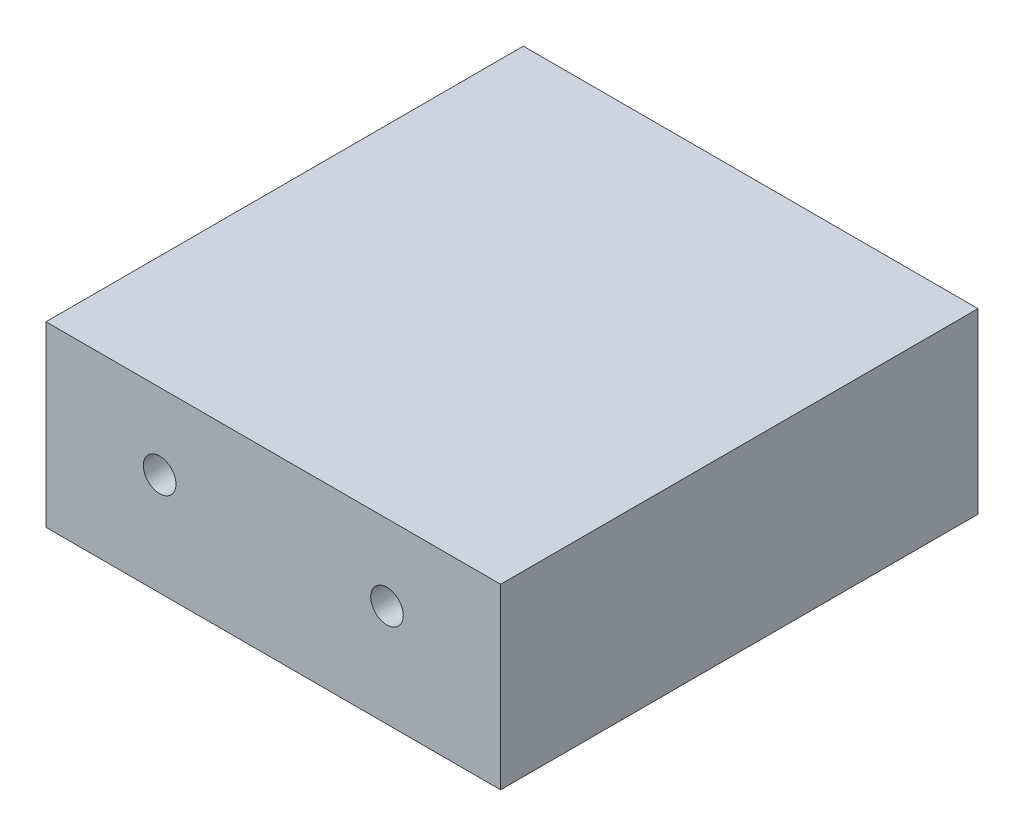
ISO-10303-21;
HEADER;
FILE_DESCRIPTION(('STEP AP214'),'2;1');
FILE_NAME('part.step','',(''),(''),'','','');
FILE_SCHEMA(('AUTOMOTIVE_DESIGN { 1 0 10303 214 1 1 1 1 }'));
ENDSEC;
DATA;
#1=APPLICATION_CONTEXT('core data for automotive mechanical design processes');
#2=APPLICATION_PROTOCOL_DEFINITION('international standard','automotive_design',2000,#1);
#3=PRODUCT_CONTEXT('',#1,'mechanical');
#4=PRODUCT('Part','Part','',(#3));
#5=PRODUCT_RELATED_PRODUCT_CATEGORY('part','',(#4));
#6=PRODUCT_DEFINITION_FORMATION('','',#4);
#7=PRODUCT_DEFINITION_CONTEXT('part definition',#1,'design');
#8=PRODUCT_DEFINITION('design','',#6,#7);
#9=PRODUCT_DEFINITION_SHAPE('','',#8);
#10=(LENGTH_UNIT() NAMED_UNIT(*) SI_UNIT(.MILLI.,.METRE.));
#11=(NAMED_UNIT(*) PLANE_ANGLE_UNIT() SI_UNIT($,.RADIAN.));
#12=(NAMED_UNIT(*) SI_UNIT($,.STERADIAN.) SOLID_ANGLE_UNIT());
#13=UNCERTAINTY_MEASURE_WITH_UNIT(LENGTH_MEASURE(1.E-05),#10,'distance_accuracy_value','');
#14=(GEOMETRIC_REPRESENTATION_CONTEXT(3) GLOBAL_UNCERTAINTY_ASSIGNED_CONTEXT((#13)) GLOBAL_UNIT_ASSIGNED_CONTEXT((#10,
#11,#12)) REPRESENTATION_CONTEXT('',''));
#15=CARTESIAN_POINT('',(0.,0.,0.));
#16=DIRECTION('',(0.,0.,1.));
#17=DIRECTION('',(1.,0.,0.));
#18=AXIS2_PLACEMENT_3D('',#15,#16,#17);
#19=CARTESIAN_POINT('',(-30.,23.5,-25.));
#20=DIRECTION('',(1.,0.,0.));
#21=DIRECTION('',(0.,0.,-1.));
#22=AXIS2_PLACEMENT_3D('',#19,#20,#21);
#23=PLANE('',#22);
#24=DIRECTION('',(0.,0.,1.));
#25=VECTOR('',#24,1.);
#26=CARTESIAN_POINT('',(-30.,0.,-25.));
#27=LINE('',#26,#25);
#28=CARTESIAN_POINT('',(-30.,0.,-25.));
#29=VERTEX_POINT('',#28);
#30=CARTESIAN_POINT('',(-30.,0.,38.));
#31=VERTEX_POINT('',#30);
#32=EDGE_CURVE('E105',#29,#31,#27,.T.);
#33=ORIENTED_EDGE('',*,*,#32,.T.);
#34=DIRECTION('',(0.,-1.,0.));
#35=VECTOR('',#34,1.);
#36=CARTESIAN_POINT('',(-30.,23.5,38.));
#37=LINE('',#36,#35);
#38=CARTESIAN_POINT('',(-30.,23.5,38.));
#39=VERTEX_POINT('',#38);
#40=EDGE_CURVE('E11',#39,#31,#37,.T.);
#41=ORIENTED_EDGE('',*,*,#40,.F.);
#42=DIRECTION('',(0.,0.,1.));
#43=VECTOR('',#42,1.);
#44=CARTESIAN_POINT('',(-30.,23.5,-25.));
#45=LINE('',#44,#43);
#46=CARTESIAN_POINT('',(-30.,23.5,-25.));
#47=VERTEX_POINT('',#46);
#48=EDGE_CURVE('E89',#47,#39,#45,.T.);
#49=ORIENTED_EDGE('',*,*,#48,.F.);
#50=DIRECTION('',(0.,-1.,0.));
#51=VECTOR('',#50,1.);
#52=CARTESIAN_POINT('',(-30.,23.5,-25.));
#53=LINE('',#52,#51);
#54=EDGE_CURVE('E98',#47,#29,#53,.T.);
#55=ORIENTED_EDGE('',*,*,#54,.T.);
#56=EDGE_LOOP('',(#33,#41,#49,#55));
#57=FACE_BOUND('',#56,.T.);
#58=ADVANCED_FACE('F39',(#57),#23,.F.);
#59=CARTESIAN_POINT('',(-30.,23.5,38.));
#60=DIRECTION('',(0.,0.,-1.));
#61=DIRECTION('',(-1.,0.,0.));
#62=AXIS2_PLACEMENT_3D('',#59,#60,#61);
#63=PLANE('',#62);
#64=CARTESIAN_POINT('',(15.,13.5,38.));
#65=DIRECTION('',(0.,0.,1.));
#66=DIRECTION('',(1.,0.,0.));
#67=AXIS2_PLACEMENT_3D('',#64,#65,#66);
#68=CIRCLE('',#67,2.15);
#69=CARTESIAN_POINT('',(17.15,13.5,38.));
#70=VERTEX_POINT('',#69);
#71=EDGE_CURVE('E122',#70,#70,#68,.T.);
#72=ORIENTED_EDGE('',*,*,#71,.F.);
#73=EDGE_LOOP('',(#72));
#74=FACE_BOUND('',#73,.T.);
#75=CARTESIAN_POINT('',(-15.,13.5,38.));
#76=DIRECTION('',(0.,0.,1.));
#77=DIRECTION('',(1.,0.,0.));
#78=AXIS2_PLACEMENT_3D('',#75,#76,#77);
#79=CIRCLE('',#78,2.15);
#80=CARTESIAN_POINT('',(-12.85,13.5,38.));
#81=VERTEX_POINT('',#80);
#82=EDGE_CURVE('E117',#81,#81,#79,.T.);
#83=ORIENTED_EDGE('',*,*,#82,.F.);
#84=EDGE_LOOP('',(#83));
#85=FACE_BOUND('',#84,.T.);
#86=DIRECTION('',(1.,0.,0.));
#87=VECTOR('',#86,1.);
#88=CARTESIAN_POINT('',(-30.,0.,38.));
#89=LINE('',#88,#87);
#90=CARTESIAN_POINT('',(30.,0.,38.));
#91=VERTEX_POINT('',#90);
#92=EDGE_CURVE('E94',#31,#91,#89,.T.);
#93=ORIENTED_EDGE('',*,*,#92,.T.);
#94=DIRECTION('',(0.,-1.,0.));
#95=VECTOR('',#94,1.);
#96=CARTESIAN_POINT('',(30.,23.5,38.));
#97=LINE('',#96,#95);
#98=CARTESIAN_POINT('',(30.,23.5,38.));
#99=VERTEX_POINT('',#98);
#100=EDGE_CURVE('E50',#99,#91,#97,.T.);
#101=ORIENTED_EDGE('',*,*,#100,.F.);
#102=DIRECTION('',(1.,0.,0.));
#103=VECTOR('',#102,1.);
#104=CARTESIAN_POINT('',(-30.,23.5,38.));
#105=LINE('',#104,#103);
#106=EDGE_CURVE('E81',#39,#99,#105,.T.);
#107=ORIENTED_EDGE('',*,*,#106,.F.);
#108=ORIENTED_EDGE('',*,*,#40,.T.);
#109=EDGE_LOOP('',(#93,#101,#107,#108));
#110=FACE_BOUND('',#109,.T.);
#111=ADVANCED_FACE('F91',(#74,#85,#110),#63,.F.);
#112=CARTESIAN_POINT('',(30.,23.5,-25.));
#113=DIRECTION('',(-1.,0.,0.));
#114=DIRECTION('',(0.,0.,1.));
#115=AXIS2_PLACEMENT_3D('',#112,#113,#114);
#116=PLANE('',#115);
#117=DIRECTION('',(0.,0.,-1.));
#118=VECTOR('',#117,1.);
#119=CARTESIAN_POINT('',(30.,0.,-25.));
#120=LINE('',#119,#118);
#121=CARTESIAN_POINT('',(30.,0.,-25.));
#122=VERTEX_POINT('',#121);
#123=EDGE_CURVE('E75',#91,#122,#120,.T.);
#124=ORIENTED_EDGE('',*,*,#123,.T.);
#125=DIRECTION('',(0.,-1.,0.));
#126=VECTOR('',#125,1.);
#127=CARTESIAN_POINT('',(30.,23.5,-25.));
#128=LINE('',#127,#126);
#129=CARTESIAN_POINT('',(30.,23.5,-25.));
#130=VERTEX_POINT('',#129);
#131=EDGE_CURVE('E92',#130,#122,#128,.T.);
#132=ORIENTED_EDGE('',*,*,#131,.F.);
#133=DIRECTION('',(0.,0.,-1.));
#134=VECTOR('',#133,1.);
#135=CARTESIAN_POINT('',(30.,23.5,-25.));
#136=LINE('',#135,#134);
#137=EDGE_CURVE('E86',#99,#130,#136,.T.);
#138=ORIENTED_EDGE('',*,*,#137,.F.);
#139=ORIENTED_EDGE('',*,*,#100,.T.);
#140=EDGE_LOOP('',(#124,#132,#138,#139));
#141=FACE_BOUND('',#140,.T.);
#142=ADVANCED_FACE('F96',(#141),#116,.F.);
#143=CARTESIAN_POINT('',(-30.,23.5,-25.));
#144=DIRECTION('',(0.,0.,1.));
#145=DIRECTION('',(1.,0.,0.));
#146=AXIS2_PLACEMENT_3D('',#143,#144,#145);
#147=PLANE('',#146);
#148=DIRECTION('',(-1.,0.,0.));
#149=VECTOR('',#148,1.);
#150=CARTESIAN_POINT('',(-30.,0.,-25.));
#151=LINE('',#150,#149);
#152=EDGE_CURVE('E76',#122,#29,#151,.T.);
#153=ORIENTED_EDGE('',*,*,#152,.T.);
#154=ORIENTED_EDGE('',*,*,#54,.F.);
#155=DIRECTION('',(-1.,0.,0.));
#156=VECTOR('',#155,1.);
#157=CARTESIAN_POINT('',(-30.,23.5,-25.));
#158=LINE('',#157,#156);
#159=EDGE_CURVE('E54',#130,#47,#158,.T.);
#160=ORIENTED_EDGE('',*,*,#159,.F.);
#161=ORIENTED_EDGE('',*,*,#131,.T.);
#162=EDGE_LOOP('',(#153,#154,#160,#161));
#163=FACE_BOUND('',#162,.T.);
#164=ADVANCED_FACE('F109',(#163),#147,.F.);
#165=CARTESIAN_POINT('',(0.,23.5,0.));
#166=DIRECTION('',(0.,1.,0.));
#167=DIRECTION('',(0.,0.,1.));
#168=AXIS2_PLACEMENT_3D('',#165,#166,#167);
#169=PLANE('',#168);
#170=ORIENTED_EDGE('',*,*,#48,.T.);
#171=ORIENTED_EDGE('',*,*,#106,.T.);
#172=ORIENTED_EDGE('',*,*,#137,.T.);
#173=ORIENTED_EDGE('',*,*,#159,.T.);
#174=EDGE_LOOP('',(#170,#171,#172,#173));
#175=FACE_BOUND('',#174,.T.);
#176=ADVANCED_FACE('F88',(#175),#169,.T.);
#177=CARTESIAN_POINT('',(0.,0.,0.));
#178=DIRECTION('',(0.,1.,0.));
#179=DIRECTION('',(0.,0.,1.));
#180=AXIS2_PLACEMENT_3D('',#177,#178,#179);
#181=PLANE('',#180);
#182=CARTESIAN_POINT('',(-15.,0.,15.));
#183=DIRECTION('',(0.,1.,0.));
#184=DIRECTION('',(0.,0.,1.));
#185=AXIS2_PLACEMENT_3D('',#182,#183,#184);
#186=CIRCLE('',#185,2.8);
#187=CARTESIAN_POINT('',(-15.,0.,17.8));
#188=VERTEX_POINT('',#187);
#189=EDGE_CURVE('E133',#188,#188,#186,.T.);
#190=ORIENTED_EDGE('',*,*,#189,.T.);
#191=EDGE_LOOP('',(#190));
#192=FACE_BOUND('',#191,.T.);
#193=CARTESIAN_POINT('',(15.,0.,-15.));
#194=DIRECTION('',(0.,1.,0.));
#195=DIRECTION('',(0.,0.,1.));
#196=AXIS2_PLACEMENT_3D('',#193,#194,#195);
#197=CIRCLE('',#196,2.8);
#198=CARTESIAN_POINT('',(15.,0.,-12.2));
#199=VERTEX_POINT('',#198);
#200=EDGE_CURVE('E139',#199,#199,#197,.T.);
#201=ORIENTED_EDGE('',*,*,#200,.T.);
#202=EDGE_LOOP('',(#201));
#203=FACE_BOUND('',#202,.T.);
#204=CARTESIAN_POINT('',(-15.,0.,-15.));
#205=DIRECTION('',(0.,1.,0.));
#206=DIRECTION('',(0.,0.,1.));
#207=AXIS2_PLACEMENT_3D('',#204,#205,#206);
#208=CIRCLE('',#207,2.8);
#209=CARTESIAN_POINT('',(-15.,0.,-12.2));
#210=VERTEX_POINT('',#209);
#211=EDGE_CURVE('E137',#210,#210,#208,.T.);
#212=ORIENTED_EDGE('',*,*,#211,.T.);
#213=EDGE_LOOP('',(#212));
#214=FACE_BOUND('',#213,.T.);
#215=CARTESIAN_POINT('',(15.,0.,15.));
#216=DIRECTION('',(0.,1.,0.));
#217=DIRECTION('',(0.,0.,1.));
#218=AXIS2_PLACEMENT_3D('',#215,#216,#217);
#219=CIRCLE('',#218,2.8);
#220=CARTESIAN_POINT('',(15.,0.,17.8));
#221=VERTEX_POINT('',#220);
#222=EDGE_CURVE('E126',#221,#221,#219,.T.);
#223=ORIENTED_EDGE('',*,*,#222,.T.);
#224=EDGE_LOOP('',(#223));
#225=FACE_BOUND('',#224,.T.);
#226=ORIENTED_EDGE('',*,*,#32,.F.);
#227=ORIENTED_EDGE('',*,*,#152,.F.);
#228=ORIENTED_EDGE('',*,*,#123,.F.);
#229=ORIENTED_EDGE('',*,*,#92,.F.);
#230=EDGE_LOOP('',(#226,#227,#228,#229));
#231=FACE_BOUND('',#230,.T.);
#232=ADVANCED_FACE('F114',(#192,#203,#214,#225,#231),#181,.F.);
#233=CARTESIAN_POINT('',(-15.,13.5,30.));
#234=DIRECTION('',(0.,0.,1.));
#235=DIRECTION('',(1.,0.,0.));
#236=AXIS2_PLACEMENT_3D('',#233,#234,#235);
#237=CYLINDRICAL_SURFACE('',#236,2.15);
#238=CARTESIAN_POINT('',(-15.,13.5,30.));
#239=DIRECTION('',(0.,0.,1.));
#240=DIRECTION('',(1.,0.,0.));
#241=AXIS2_PLACEMENT_3D('',#238,#239,#240);
#242=CIRCLE('',#241,2.15);
#243=CARTESIAN_POINT('',(-12.85,13.5,30.));
#244=VERTEX_POINT('',#243);
#245=EDGE_CURVE('E118',#244,#244,#242,.T.);
#246=ORIENTED_EDGE('',*,*,#245,.F.);
#247=EDGE_LOOP('',(#246));
#248=FACE_BOUND('',#247,.T.);
#249=ORIENTED_EDGE('',*,*,#82,.T.);
#250=EDGE_LOOP('',(#249));
#251=FACE_BOUND('',#250,.T.);
#252=ADVANCED_FACE('F186',(#248,#251),#237,.F.);
#253=CARTESIAN_POINT('',(-15.,13.5,30.));
#254=DIRECTION('',(0.,0.,1.));
#255=DIRECTION('',(1.,0.,0.));
#256=AXIS2_PLACEMENT_3D('',#253,#254,#255);
#257=PLANE('',#256);
#258=ORIENTED_EDGE('',*,*,#245,.T.);
#259=EDGE_LOOP('',(#258));
#260=FACE_BOUND('',#259,.T.);
#261=ADVANCED_FACE('F193',(#260),#257,.T.);
#262=CARTESIAN_POINT('',(15.,13.5,30.));
#263=DIRECTION('',(0.,0.,1.));
#264=DIRECTION('',(1.,0.,0.));
#265=AXIS2_PLACEMENT_3D('',#262,#263,#264);
#266=CYLINDRICAL_SURFACE('',#265,2.15);
#267=CARTESIAN_POINT('',(15.,13.5,30.));
#268=DIRECTION('',(0.,0.,1.));
#269=DIRECTION('',(1.,0.,0.));
#270=AXIS2_PLACEMENT_3D('',#267,#268,#269);
#271=CIRCLE('',#270,2.15);
#272=CARTESIAN_POINT('',(17.15,13.5,30.));
#273=VERTEX_POINT('',#272);
#274=EDGE_CURVE('E104',#273,#273,#271,.T.);
#275=ORIENTED_EDGE('',*,*,#274,.F.);
#276=EDGE_LOOP('',(#275));
#277=FACE_BOUND('',#276,.T.);
#278=ORIENTED_EDGE('',*,*,#71,.T.);
#279=EDGE_LOOP('',(#278));
#280=FACE_BOUND('',#279,.T.);
#281=ADVANCED_FACE('F195',(#277,#280),#266,.F.);
#282=CARTESIAN_POINT('',(15.,13.5,30.));
#283=DIRECTION('',(0.,0.,1.));
#284=DIRECTION('',(1.,0.,0.));
#285=AXIS2_PLACEMENT_3D('',#282,#283,#284);
#286=PLANE('',#285);
#287=ORIENTED_EDGE('',*,*,#274,.T.);
#288=EDGE_LOOP('',(#287));
#289=FACE_BOUND('',#288,.T.);
#290=ADVANCED_FACE('F199',(#289),#286,.T.);
#291=CARTESIAN_POINT('',(15.,8.1,15.));
#292=DIRECTION('',(0.,-1.,0.));
#293=DIRECTION('',(0.,0.,-1.));
#294=AXIS2_PLACEMENT_3D('',#291,#292,#293);
#295=CYLINDRICAL_SURFACE('',#294,2.8);
#296=CARTESIAN_POINT('',(15.,8.1,15.));
#297=DIRECTION('',(0.,1.,0.));
#298=DIRECTION('',(0.,0.,1.));
#299=AXIS2_PLACEMENT_3D('',#296,#297,#298);
#300=CIRCLE('',#299,2.8);
#301=CARTESIAN_POINT('',(15.,8.1,17.8));
#302=VERTEX_POINT('',#301);
#303=EDGE_CURVE('E119',#302,#302,#300,.T.);
#304=ORIENTED_EDGE('',*,*,#303,.T.);
#305=EDGE_LOOP('',(#304));
#306=FACE_BOUND('',#305,.T.);
#307=ORIENTED_EDGE('',*,*,#222,.F.);
#308=EDGE_LOOP('',(#307));
#309=FACE_BOUND('',#308,.T.);
#310=ADVANCED_FACE('F170',(#306,#309),#295,.F.);
#311=CARTESIAN_POINT('',(15.,8.1,15.));
#312=DIRECTION('',(0.,1.,0.));
#313=DIRECTION('',(0.,0.,1.));
#314=AXIS2_PLACEMENT_3D('',#311,#312,#313);
#315=PLANE('',#314);
#316=ORIENTED_EDGE('',*,*,#303,.F.);
#317=EDGE_LOOP('',(#316));
#318=FACE_BOUND('',#317,.T.);
#319=ADVANCED_FACE('F160',(#318),#315,.F.);
#320=CARTESIAN_POINT('',(-15.,8.1,-15.));
#321=DIRECTION('',(0.,-1.,0.));
#322=DIRECTION('',(0.,0.,-1.));
#323=AXIS2_PLACEMENT_3D('',#320,#321,#322);
#324=CYLINDRICAL_SURFACE('',#323,2.8);
#325=CARTESIAN_POINT('',(-15.,8.1,-15.));
#326=DIRECTION('',(0.,1.,0.));
#327=DIRECTION('',(0.,0.,1.));
#328=AXIS2_PLACEMENT_3D('',#325,#326,#327);
#329=CIRCLE('',#328,2.8);
#330=CARTESIAN_POINT('',(-15.,8.1,-12.2));
#331=VERTEX_POINT('',#330);
#332=EDGE_CURVE('E148',#331,#331,#329,.T.);
#333=ORIENTED_EDGE('',*,*,#332,.T.);
#334=EDGE_LOOP('',(#333));
#335=FACE_BOUND('',#334,.T.);
#336=ORIENTED_EDGE('',*,*,#211,.F.);
#337=EDGE_LOOP('',(#336));
#338=FACE_BOUND('',#337,.T.);
#339=ADVANCED_FACE('F152',(#335,#338),#324,.F.);
#340=CARTESIAN_POINT('',(-15.,8.1,-15.));
#341=DIRECTION('',(0.,1.,0.));
#342=DIRECTION('',(0.,0.,1.));
#343=AXIS2_PLACEMENT_3D('',#340,#341,#342);
#344=PLANE('',#343);
#345=ORIENTED_EDGE('',*,*,#332,.F.);
#346=EDGE_LOOP('',(#345));
#347=FACE_BOUND('',#346,.T.);
#348=ADVANCED_FACE('F156',(#347),#344,.F.);
#349=CARTESIAN_POINT('',(15.,8.1,-15.));
#350=DIRECTION('',(0.,-1.,0.));
#351=DIRECTION('',(0.,0.,-1.));
#352=AXIS2_PLACEMENT_3D('',#349,#350,#351);
#353=CYLINDRICAL_SURFACE('',#352,2.8);
#354=CARTESIAN_POINT('',(15.,8.1,-15.));
#355=DIRECTION('',(0.,1.,0.));
#356=DIRECTION('',(0.,0.,1.));
#357=AXIS2_PLACEMENT_3D('',#354,#355,#356);
#358=CIRCLE('',#357,2.8);
#359=CARTESIAN_POINT('',(15.,8.1,-12.2));
#360=VERTEX_POINT('',#359);
#361=EDGE_CURVE('E132',#360,#360,#358,.T.);
#362=ORIENTED_EDGE('',*,*,#361,.T.);
#363=EDGE_LOOP('',(#362));
#364=FACE_BOUND('',#363,.T.);
#365=ORIENTED_EDGE('',*,*,#200,.F.);
#366=EDGE_LOOP('',(#365));
#367=FACE_BOUND('',#366,.T.);
#368=ADVANCED_FACE('F163',(#364,#367),#353,.F.);
#369=CARTESIAN_POINT('',(15.,8.1,-15.));
#370=DIRECTION('',(0.,1.,0.));
#371=DIRECTION('',(0.,0.,1.));
#372=AXIS2_PLACEMENT_3D('',#369,#370,#371);
#373=PLANE('',#372);
#374=ORIENTED_EDGE('',*,*,#361,.F.);
#375=EDGE_LOOP('',(#374));
#376=FACE_BOUND('',#375,.T.);
#377=ADVANCED_FACE('F208',(#376),#373,.F.);
#378=CARTESIAN_POINT('',(-15.,8.1,15.));
#379=DIRECTION('',(0.,-1.,0.));
#380=DIRECTION('',(0.,0.,-1.));
#381=AXIS2_PLACEMENT_3D('',#378,#379,#380);
#382=CYLINDRICAL_SURFACE('',#381,2.8);
#383=CARTESIAN_POINT('',(-15.,8.1,15.));
#384=DIRECTION('',(0.,1.,0.));
#385=DIRECTION('',(0.,0.,1.));
#386=AXIS2_PLACEMENT_3D('',#383,#384,#385);
#387=CIRCLE('',#386,2.8);
#388=CARTESIAN_POINT('',(-15.,8.1,17.8));
#389=VERTEX_POINT('',#388);
#390=EDGE_CURVE('E143',#389,#389,#387,.T.);
#391=ORIENTED_EDGE('',*,*,#390,.T.);
#392=EDGE_LOOP('',(#391));
#393=FACE_BOUND('',#392,.T.);
#394=ORIENTED_EDGE('',*,*,#189,.F.);
#395=EDGE_LOOP('',(#394));
#396=FACE_BOUND('',#395,.T.);
#397=ADVANCED_FACE('F211',(#393,#396),#382,.F.);
#398=CARTESIAN_POINT('',(-15.,8.1,15.));
#399=DIRECTION('',(0.,1.,0.));
#400=DIRECTION('',(0.,0.,1.));
#401=AXIS2_PLACEMENT_3D('',#398,#399,#400);
#402=PLANE('',#401);
#403=ORIENTED_EDGE('',*,*,#390,.F.);
#404=EDGE_LOOP('',(#403));
#405=FACE_BOUND('',#404,.T.);
#406=ADVANCED_FACE('F216',(#405),#402,.F.);
#407=CLOSED_SHELL('',(#58,#111,#142,#164,#176,#232,#252,#261,#281,#290,#310,#319,#339,#348,#368,
#377,#397,#406));
#408=MANIFOLD_SOLID_BREP('B2',#407);
#409=ADVANCED_BREP_SHAPE_REPRESENTATION('',(#18,#408),#14);
#410=SHAPE_DEFINITION_REPRESENTATION(#9,#409);
ENDSEC;
END-ISO-10303-21;
